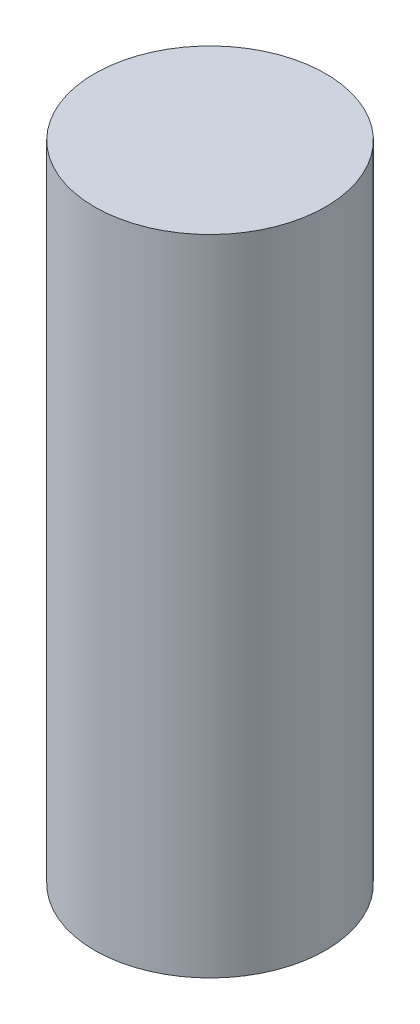
ISO-10303-21;
HEADER;
FILE_DESCRIPTION(('STEP AP214'),'2;1');
FILE_NAME('part.step','',(''),(''),'','','');
FILE_SCHEMA(('AUTOMOTIVE_DESIGN { 1 0 10303 214 1 1 1 1 }'));
ENDSEC;
DATA;
#1=APPLICATION_CONTEXT('core data for automotive mechanical design processes');
#2=APPLICATION_PROTOCOL_DEFINITION('international standard','automotive_design',2000,#1);
#3=PRODUCT_CONTEXT('',#1,'mechanical');
#4=PRODUCT('Part','Part','',(#3));
#5=PRODUCT_RELATED_PRODUCT_CATEGORY('part','',(#4));
#6=PRODUCT_DEFINITION_FORMATION('','',#4);
#7=PRODUCT_DEFINITION_CONTEXT('part definition',#1,'design');
#8=PRODUCT_DEFINITION('design','',#6,#7);
#9=PRODUCT_DEFINITION_SHAPE('','',#8);
#10=(LENGTH_UNIT() NAMED_UNIT(*) SI_UNIT(.MILLI.,.METRE.));
#11=(NAMED_UNIT(*) PLANE_ANGLE_UNIT() SI_UNIT($,.RADIAN.));
#12=(NAMED_UNIT(*) SI_UNIT($,.STERADIAN.) SOLID_ANGLE_UNIT());
#13=UNCERTAINTY_MEASURE_WITH_UNIT(LENGTH_MEASURE(1.E-05),#10,'distance_accuracy_value','');
#14=(GEOMETRIC_REPRESENTATION_CONTEXT(3) GLOBAL_UNCERTAINTY_ASSIGNED_CONTEXT((#13)) GLOBAL_UNIT_ASSIGNED_CONTEXT((#10,
#11,#12)) REPRESENTATION_CONTEXT('',''));
#15=CARTESIAN_POINT('',(0.,0.,0.));
#16=DIRECTION('',(0.,0.,1.));
#17=DIRECTION('',(1.,0.,0.));
#18=AXIS2_PLACEMENT_3D('',#15,#16,#17);
#19=CARTESIAN_POINT('',(0.,173.5,0.));
#20=DIRECTION('',(0.,-1.,0.));
#21=DIRECTION('',(0.,0.,-1.));
#22=AXIS2_PLACEMENT_3D('',#19,#20,#21);
#23=CYLINDRICAL_SURFACE('',#22,31.125);
#24=CARTESIAN_POINT('',(0.,173.5,0.));
#25=DIRECTION('',(0.,1.,0.));
#26=DIRECTION('',(0.,0.,1.));
#27=AXIS2_PLACEMENT_3D('',#24,#25,#26);
#28=CIRCLE('',#27,31.125);
#29=CARTESIAN_POINT('',(0.,173.5,31.125));
#30=VERTEX_POINT('',#29);
#31=EDGE_CURVE('E10',#30,#30,#28,.T.);
#32=ORIENTED_EDGE('',*,*,#31,.F.);
#33=EDGE_LOOP('',(#32));
#34=FACE_BOUND('',#33,.T.);
#35=CARTESIAN_POINT('',(0.,0.,0.));
#36=DIRECTION('',(0.,1.,0.));
#37=DIRECTION('',(0.,0.,1.));
#38=AXIS2_PLACEMENT_3D('',#35,#36,#37);
#39=CIRCLE('',#38,31.125);
#40=CARTESIAN_POINT('',(0.,0.,31.125));
#41=VERTEX_POINT('',#40);
#42=EDGE_CURVE('E46',#41,#41,#39,.T.);
#43=ORIENTED_EDGE('',*,*,#42,.T.);
#44=EDGE_LOOP('',(#43));
#45=FACE_BOUND('',#44,.T.);
#46=ADVANCED_FACE('F43',(#34,#45),#23,.T.);
#47=CARTESIAN_POINT('',(0.,173.5,0.));
#48=DIRECTION('',(0.,1.,0.));
#49=DIRECTION('',(0.,0.,1.));
#50=AXIS2_PLACEMENT_3D('',#47,#48,#49);
#51=PLANE('',#50);
#52=ORIENTED_EDGE('',*,*,#31,.T.);
#53=EDGE_LOOP('',(#52));
#54=FACE_BOUND('',#53,.T.);
#55=ADVANCED_FACE('F60',(#54),#51,.T.);
#56=CARTESIAN_POINT('',(0.,0.,0.));
#57=DIRECTION('',(0.,1.,0.));
#58=DIRECTION('',(0.,0.,1.));
#59=AXIS2_PLACEMENT_3D('',#56,#57,#58);
#60=PLANE('',#59);
#61=ORIENTED_EDGE('',*,*,#42,.F.);
#62=EDGE_LOOP('',(#61));
#63=FACE_BOUND('',#62,.T.);
#64=ADVANCED_FACE('F58',(#63),#60,.F.);
#65=CLOSED_SHELL('',(#46,#55,#64));
#66=MANIFOLD_SOLID_BREP('B2',#65);
#67=ADVANCED_BREP_SHAPE_REPRESENTATION('',(#18,#66),#14);
#68=SHAPE_DEFINITION_REPRESENTATION(#9,#67);
ENDSEC;
END-ISO-10303-21;
